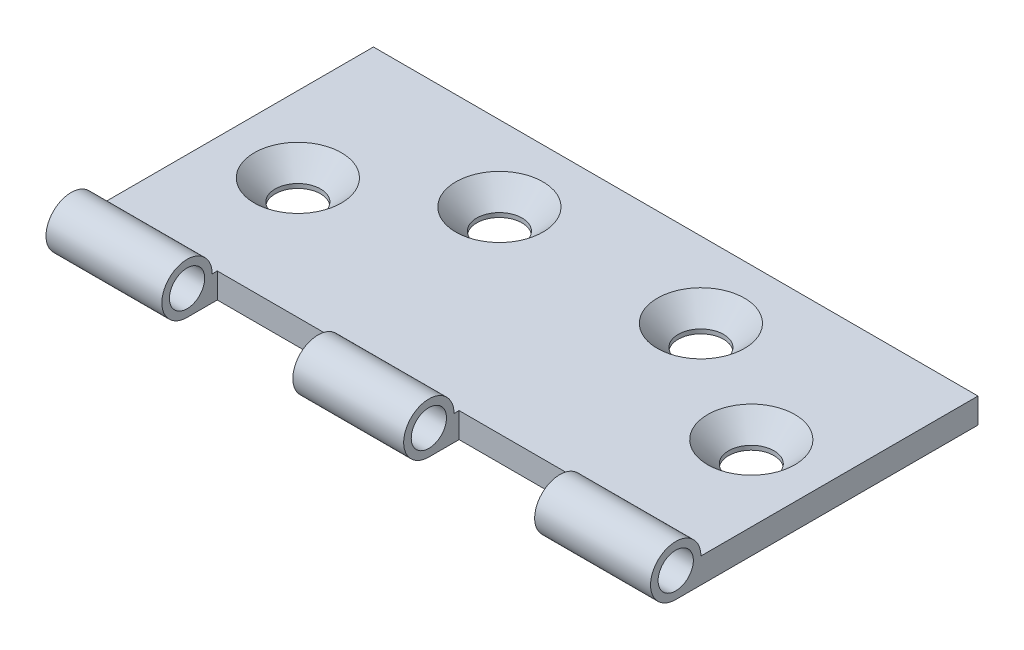
ISO-10303-21;
HEADER;
FILE_DESCRIPTION(('STEP AP214'),'2;1');
FILE_NAME('part.step','',(''),(''),'','','');
FILE_SCHEMA(('AUTOMOTIVE_DESIGN { 1 0 10303 214 1 1 1 1 }'));
ENDSEC;
DATA;
#1=APPLICATION_CONTEXT('core data for automotive mechanical design processes');
#2=APPLICATION_PROTOCOL_DEFINITION('international standard','automotive_design',2000,#1);
#3=PRODUCT_CONTEXT('',#1,'mechanical');
#4=PRODUCT('Part','Part','',(#3));
#5=PRODUCT_RELATED_PRODUCT_CATEGORY('part','',(#4));
#6=PRODUCT_DEFINITION_FORMATION('','',#4);
#7=PRODUCT_DEFINITION_CONTEXT('part definition',#1,'design');
#8=PRODUCT_DEFINITION('design','',#6,#7);
#9=PRODUCT_DEFINITION_SHAPE('','',#8);
#10=(LENGTH_UNIT() NAMED_UNIT(*) SI_UNIT(.MILLI.,.METRE.));
#11=(NAMED_UNIT(*) PLANE_ANGLE_UNIT() SI_UNIT($,.RADIAN.));
#12=(NAMED_UNIT(*) SI_UNIT($,.STERADIAN.) SOLID_ANGLE_UNIT());
#13=UNCERTAINTY_MEASURE_WITH_UNIT(LENGTH_MEASURE(1.E-05),#10,'distance_accuracy_value','');
#14=(GEOMETRIC_REPRESENTATION_CONTEXT(3) GLOBAL_UNCERTAINTY_ASSIGNED_CONTEXT((#13)) GLOBAL_UNIT_ASSIGNED_CONTEXT((#10,
#11,#12)) REPRESENTATION_CONTEXT('',''));
#15=CARTESIAN_POINT('',(0.,0.,0.));
#16=DIRECTION('',(0.,0.,1.));
#17=DIRECTION('',(1.,0.,0.));
#18=AXIS2_PLACEMENT_3D('',#15,#16,#17);
#19=CARTESIAN_POINT('',(60.,5.,60.));
#20=DIRECTION('',(-1.,0.,0.));
#21=DIRECTION('',(0.,0.,1.));
#22=AXIS2_PLACEMENT_3D('',#19,#20,#21);
#23=CYLINDRICAL_SURFACE('',#22,5.);
#24=DIRECTION('',(-1.,0.,0.));
#25=VECTOR('',#24,1.);
#26=CARTESIAN_POINT('',(60.,5.,55.));
#27=LINE('',#26,#25);
#28=CARTESIAN_POINT('',(60.,5.,55.));
#29=VERTEX_POINT('',#28);
#30=CARTESIAN_POINT('',(37.,5.,55.));
#31=VERTEX_POINT('',#30);
#32=EDGE_CURVE('E94',#29,#31,#27,.T.);
#33=ORIENTED_EDGE('',*,*,#32,.T.);
#34=CARTESIAN_POINT('',(37.,5.,60.));
#35=DIRECTION('',(1.,0.,0.));
#36=DIRECTION('',(0.,0.,-1.));
#37=AXIS2_PLACEMENT_3D('',#34,#35,#36);
#38=CIRCLE('',#37,5.);
#39=CARTESIAN_POINT('',(37.,0.,60.));
#40=VERTEX_POINT('',#39);
#41=EDGE_CURVE('E132',#31,#40,#38,.T.);
#42=ORIENTED_EDGE('',*,*,#41,.T.);
#43=DIRECTION('',(-1.,0.,0.));
#44=VECTOR('',#43,1.);
#45=CARTESIAN_POINT('',(60.,0.,60.));
#46=LINE('',#45,#44);
#47=CARTESIAN_POINT('',(60.,0.,60.));
#48=VERTEX_POINT('',#47);
#49=EDGE_CURVE('E11',#48,#40,#46,.T.);
#50=ORIENTED_EDGE('',*,*,#49,.F.);
#51=CARTESIAN_POINT('',(60.,5.,60.));
#52=DIRECTION('',(1.,0.,0.));
#53=DIRECTION('',(0.,0.,-1.));
#54=AXIS2_PLACEMENT_3D('',#51,#52,#53);
#55=CIRCLE('',#54,5.);
#56=EDGE_CURVE('E182',#29,#48,#55,.T.);
#57=ORIENTED_EDGE('',*,*,#56,.F.);
#58=EDGE_LOOP('',(#33,#42,#50,#57));
#59=FACE_BOUND('',#58,.T.);
#60=ADVANCED_FACE('F39',(#59),#23,.T.);
#61=CARTESIAN_POINT('',(-37.,0.,60.));
#62=VERTEX_POINT('',#61);
#63=CARTESIAN_POINT('',(-60.,0.,60.));
#64=VERTEX_POINT('',#63);
#65=EDGE_CURVE('E51',#62,#64,#46,.T.);
#66=ORIENTED_EDGE('',*,*,#65,.F.);
#67=CARTESIAN_POINT('',(-37.,5.,60.));
#68=DIRECTION('',(-1.,0.,0.));
#69=DIRECTION('',(0.,0.,1.));
#70=AXIS2_PLACEMENT_3D('',#67,#68,#69);
#71=CIRCLE('',#70,5.);
#72=CARTESIAN_POINT('',(-37.,5.,55.));
#73=VERTEX_POINT('',#72);
#74=EDGE_CURVE('E110',#62,#73,#71,.T.);
#75=ORIENTED_EDGE('',*,*,#74,.T.);
#76=CARTESIAN_POINT('',(-60.,5.,55.));
#77=VERTEX_POINT('',#76);
#78=EDGE_CURVE('E188',#73,#77,#27,.T.);
#79=ORIENTED_EDGE('',*,*,#78,.T.);
#80=CARTESIAN_POINT('',(-60.,5.,60.));
#81=DIRECTION('',(1.,0.,0.));
#82=DIRECTION('',(0.,0.,-1.));
#83=AXIS2_PLACEMENT_3D('',#80,#81,#82);
#84=CIRCLE('',#83,5.);
#85=EDGE_CURVE('E92',#77,#64,#84,.T.);
#86=ORIENTED_EDGE('',*,*,#85,.T.);
#87=EDGE_LOOP('',(#66,#75,#79,#86));
#88=FACE_BOUND('',#87,.T.);
#89=ADVANCED_FACE('F299',(#88),#23,.T.);
#90=CARTESIAN_POINT('',(-60.,4.99999999999999,60.));
#91=DIRECTION('',(1.,0.,0.));
#92=DIRECTION('',(0.,0.,-1.));
#93=AXIS2_PLACEMENT_3D('',#90,#91,#92);
#94=CYLINDRICAL_SURFACE('',#93,3.5);
#95=CARTESIAN_POINT('',(37.,4.99999999999999,60.));
#96=DIRECTION('',(1.,0.,0.));
#97=DIRECTION('',(0.,0.,-1.));
#98=AXIS2_PLACEMENT_3D('',#95,#96,#97);
#99=CIRCLE('',#98,3.5);
#100=CARTESIAN_POINT('',(37.,4.99999999999999,56.5));
#101=VERTEX_POINT('',#100);
#102=EDGE_CURVE('E43',#101,#101,#99,.F.);
#103=ORIENTED_EDGE('',*,*,#102,.T.);
#104=EDGE_LOOP('',(#103));
#105=FACE_BOUND('',#104,.T.);
#106=CARTESIAN_POINT('',(60.,4.99999999999999,60.));
#107=DIRECTION('',(1.,0.,0.));
#108=DIRECTION('',(0.,0.,-1.));
#109=AXIS2_PLACEMENT_3D('',#106,#107,#108);
#110=CIRCLE('',#109,3.5);
#111=CARTESIAN_POINT('',(60.,4.99999999999999,56.5));
#112=VERTEX_POINT('',#111);
#113=EDGE_CURVE('E178',#112,#112,#110,.T.);
#114=ORIENTED_EDGE('',*,*,#113,.T.);
#115=EDGE_LOOP('',(#114));
#116=FACE_BOUND('',#115,.T.);
#117=ADVANCED_FACE('F316',(#105,#116),#94,.F.);
#118=CARTESIAN_POINT('',(-37.,4.99999999999999,60.));
#119=DIRECTION('',(-1.,0.,0.));
#120=DIRECTION('',(0.,0.,1.));
#121=AXIS2_PLACEMENT_3D('',#118,#119,#120);
#122=CIRCLE('',#121,3.5);
#123=CARTESIAN_POINT('',(-37.,4.99999999999999,63.5));
#124=VERTEX_POINT('',#123);
#125=EDGE_CURVE('E108',#124,#124,#122,.F.);
#126=ORIENTED_EDGE('',*,*,#125,.T.);
#127=EDGE_LOOP('',(#126));
#128=FACE_BOUND('',#127,.T.);
#129=CARTESIAN_POINT('',(-60.,4.99999999999999,60.));
#130=DIRECTION('',(1.,0.,0.));
#131=DIRECTION('',(0.,0.,-1.));
#132=AXIS2_PLACEMENT_3D('',#129,#130,#131);
#133=CIRCLE('',#132,3.5);
#134=CARTESIAN_POINT('',(-60.,4.99999999999999,56.5));
#135=VERTEX_POINT('',#134);
#136=EDGE_CURVE('E179',#135,#135,#133,.T.);
#137=ORIENTED_EDGE('',*,*,#136,.F.);
#138=EDGE_LOOP('',(#137));
#139=FACE_BOUND('',#138,.T.);
#140=ADVANCED_FACE('F341',(#128,#139),#94,.F.);
#141=CARTESIAN_POINT('',(60.,5.,0.));
#142=DIRECTION('',(0.,-1.,0.));
#143=DIRECTION('',(0.,0.,-1.));
#144=AXIS2_PLACEMENT_3D('',#141,#142,#143);
#145=PLANE('',#144);
#146=CARTESIAN_POINT('',(-45.,5.,30.));
#147=DIRECTION('',(0.,1.,0.));
#148=DIRECTION('',(0.,0.,1.));
#149=AXIS2_PLACEMENT_3D('',#146,#147,#148);
#150=CIRCLE('',#149,8.65);
#151=CARTESIAN_POINT('',(-45.,5.,38.65));
#152=VERTEX_POINT('',#151);
#153=EDGE_CURVE('E142',#152,#152,#150,.T.);
#154=ORIENTED_EDGE('',*,*,#153,.F.);
#155=EDGE_LOOP('',(#154));
#156=FACE_BOUND('',#155,.T.);
#157=CARTESIAN_POINT('',(-20.,5.,15.));
#158=DIRECTION('',(0.,1.,0.));
#159=DIRECTION('',(0.,0.,1.));
#160=AXIS2_PLACEMENT_3D('',#157,#158,#159);
#161=CIRCLE('',#160,8.65);
#162=CARTESIAN_POINT('',(-20.,5.,23.65));
#163=VERTEX_POINT('',#162);
#164=EDGE_CURVE('E151',#163,#163,#161,.T.);
#165=ORIENTED_EDGE('',*,*,#164,.F.);
#166=EDGE_LOOP('',(#165));
#167=FACE_BOUND('',#166,.T.);
#168=CARTESIAN_POINT('',(45.,5.,30.));
#169=DIRECTION('',(0.,1.,0.));
#170=DIRECTION('',(0.,0.,1.));
#171=AXIS2_PLACEMENT_3D('',#168,#169,#170);
#172=CIRCLE('',#171,8.65);
#173=CARTESIAN_POINT('',(45.,5.,38.65));
#174=VERTEX_POINT('',#173);
#175=EDGE_CURVE('E160',#174,#174,#172,.T.);
#176=ORIENTED_EDGE('',*,*,#175,.F.);
#177=EDGE_LOOP('',(#176));
#178=FACE_BOUND('',#177,.T.);
#179=CARTESIAN_POINT('',(20.,5.,15.));
#180=DIRECTION('',(0.,1.,0.));
#181=DIRECTION('',(0.,0.,1.));
#182=AXIS2_PLACEMENT_3D('',#179,#180,#181);
#183=CIRCLE('',#182,8.65);
#184=CARTESIAN_POINT('',(20.,5.,23.65));
#185=VERTEX_POINT('',#184);
#186=EDGE_CURVE('E169',#185,#185,#183,.T.);
#187=ORIENTED_EDGE('',*,*,#186,.F.);
#188=EDGE_LOOP('',(#187));
#189=FACE_BOUND('',#188,.T.);
#190=DIRECTION('',(1.,0.,0.));
#191=VECTOR('',#190,1.);
#192=CARTESIAN_POINT('',(60.,5.,54.));
#193=LINE('',#192,#191);
#194=CARTESIAN_POINT('',(11.,5.,54.));
#195=VERTEX_POINT('',#194);
#196=CARTESIAN_POINT('',(37.,5.,54.));
#197=VERTEX_POINT('',#196);
#198=EDGE_CURVE('E140',#195,#197,#193,.T.);
#199=ORIENTED_EDGE('',*,*,#198,.T.);
#200=DIRECTION('',(0.,0.,1.));
#201=VECTOR('',#200,1.);
#202=CARTESIAN_POINT('',(37.,5.,0.));
#203=LINE('',#202,#201);
#204=EDGE_CURVE('E135',#197,#31,#203,.T.);
#205=ORIENTED_EDGE('',*,*,#204,.T.);
#206=ORIENTED_EDGE('',*,*,#32,.F.);
#207=DIRECTION('',(0.,0.,1.));
#208=VECTOR('',#207,1.);
#209=CARTESIAN_POINT('',(60.,5.,0.));
#210=LINE('',#209,#208);
#211=CARTESIAN_POINT('',(60.,5.,0.));
#212=VERTEX_POINT('',#211);
#213=EDGE_CURVE('E81',#212,#29,#210,.T.);
#214=ORIENTED_EDGE('',*,*,#213,.F.);
#215=DIRECTION('',(-1.,0.,0.));
#216=VECTOR('',#215,1.);
#217=CARTESIAN_POINT('',(60.,5.,0.));
#218=LINE('',#217,#216);
#219=CARTESIAN_POINT('',(-60.,5.,0.));
#220=VERTEX_POINT('',#219);
#221=EDGE_CURVE('E59',#212,#220,#218,.T.);
#222=ORIENTED_EDGE('',*,*,#221,.T.);
#223=DIRECTION('',(0.,0.,1.));
#224=VECTOR('',#223,1.);
#225=CARTESIAN_POINT('',(-60.,5.,0.));
#226=LINE('',#225,#224);
#227=EDGE_CURVE('E78',#220,#77,#226,.T.);
#228=ORIENTED_EDGE('',*,*,#227,.T.);
#229=ORIENTED_EDGE('',*,*,#78,.F.);
#230=DIRECTION('',(0.,0.,-1.));
#231=VECTOR('',#230,1.);
#232=CARTESIAN_POINT('',(-37.,5.,0.));
#233=LINE('',#232,#231);
#234=CARTESIAN_POINT('',(-37.,5.,54.));
#235=VERTEX_POINT('',#234);
#236=EDGE_CURVE('E115',#73,#235,#233,.T.);
#237=ORIENTED_EDGE('',*,*,#236,.T.);
#238=DIRECTION('',(1.,0.,0.));
#239=VECTOR('',#238,1.);
#240=CARTESIAN_POINT('',(60.,5.,54.));
#241=LINE('',#240,#239);
#242=CARTESIAN_POINT('',(-11.,5.,54.));
#243=VERTEX_POINT('',#242);
#244=EDGE_CURVE('E138',#235,#243,#241,.T.);
#245=ORIENTED_EDGE('',*,*,#244,.T.);
#246=DIRECTION('',(0.,0.,1.));
#247=VECTOR('',#246,1.);
#248=CARTESIAN_POINT('',(-11.,5.,0.));
#249=LINE('',#248,#247);
#250=CARTESIAN_POINT('',(-11.,5.,55.));
#251=VERTEX_POINT('',#250);
#252=EDGE_CURVE('E111',#243,#251,#249,.T.);
#253=ORIENTED_EDGE('',*,*,#252,.T.);
#254=CARTESIAN_POINT('',(11.,5.,55.));
#255=VERTEX_POINT('',#254);
#256=EDGE_CURVE('E190',#255,#251,#27,.T.);
#257=ORIENTED_EDGE('',*,*,#256,.F.);
#258=DIRECTION('',(0.,0.,-1.));
#259=VECTOR('',#258,1.);
#260=CARTESIAN_POINT('',(11.,5.,0.));
#261=LINE('',#260,#259);
#262=EDGE_CURVE('E119',#255,#195,#261,.T.);
#263=ORIENTED_EDGE('',*,*,#262,.T.);
#264=EDGE_LOOP('',(#199,#205,#206,#214,#222,#228,#229,#237,#245,#253,#257,#263));
#265=FACE_BOUND('',#264,.T.);
#266=ADVANCED_FACE('F41',(#156,#167,#178,#189,#265),#145,.F.);
#267=CARTESIAN_POINT('',(60.,0.,0.));
#268=DIRECTION('',(0.,-1.,0.));
#269=DIRECTION('',(0.,0.,-1.));
#270=AXIS2_PLACEMENT_3D('',#267,#268,#269);
#271=PLANE('',#270);
#272=DIRECTION('',(0.,0.,-1.));
#273=VECTOR('',#272,1.);
#274=CARTESIAN_POINT('',(37.,0.,65.));
#275=LINE('',#274,#273);
#276=CARTESIAN_POINT('',(37.,0.,54.));
#277=VERTEX_POINT('',#276);
#278=EDGE_CURVE('E259',#40,#277,#275,.T.);
#279=ORIENTED_EDGE('',*,*,#278,.T.);
#280=DIRECTION('',(-1.,0.,0.));
#281=VECTOR('',#280,1.);
#282=CARTESIAN_POINT('',(37.,0.,54.));
#283=LINE('',#282,#281);
#284=CARTESIAN_POINT('',(11.,0.,54.));
#285=VERTEX_POINT('',#284);
#286=EDGE_CURVE('E264',#277,#285,#283,.T.);
#287=ORIENTED_EDGE('',*,*,#286,.T.);
#288=DIRECTION('',(0.,0.,1.));
#289=VECTOR('',#288,1.);
#290=CARTESIAN_POINT('',(11.,0.,65.));
#291=LINE('',#290,#289);
#292=CARTESIAN_POINT('',(11.,0.,60.));
#293=VERTEX_POINT('',#292);
#294=EDGE_CURVE('E261',#285,#293,#291,.T.);
#295=ORIENTED_EDGE('',*,*,#294,.T.);
#296=CARTESIAN_POINT('',(-11.,0.,60.));
#297=VERTEX_POINT('',#296);
#298=EDGE_CURVE('E49',#293,#297,#46,.T.);
#299=ORIENTED_EDGE('',*,*,#298,.T.);
#300=DIRECTION('',(0.,0.,-1.));
#301=VECTOR('',#300,1.);
#302=CARTESIAN_POINT('',(-11.,0.,65.));
#303=LINE('',#302,#301);
#304=CARTESIAN_POINT('',(-11.,0.,54.));
#305=VERTEX_POINT('',#304);
#306=EDGE_CURVE('E270',#297,#305,#303,.T.);
#307=ORIENTED_EDGE('',*,*,#306,.T.);
#308=DIRECTION('',(-1.,0.,0.));
#309=VECTOR('',#308,1.);
#310=CARTESIAN_POINT('',(-11.,0.,54.));
#311=LINE('',#310,#309);
#312=CARTESIAN_POINT('',(-37.,0.,54.));
#313=VERTEX_POINT('',#312);
#314=EDGE_CURVE('E273',#305,#313,#311,.T.);
#315=ORIENTED_EDGE('',*,*,#314,.T.);
#316=DIRECTION('',(0.,0.,1.));
#317=VECTOR('',#316,1.);
#318=CARTESIAN_POINT('',(-37.,0.,65.));
#319=LINE('',#318,#317);
#320=EDGE_CURVE('E281',#313,#62,#319,.T.);
#321=ORIENTED_EDGE('',*,*,#320,.T.);
#322=ORIENTED_EDGE('',*,*,#65,.T.);
#323=DIRECTION('',(0.,0.,1.));
#324=VECTOR('',#323,1.);
#325=CARTESIAN_POINT('',(-60.,0.,0.));
#326=LINE('',#325,#324);
#327=CARTESIAN_POINT('',(-60.,0.,0.));
#328=VERTEX_POINT('',#327);
#329=EDGE_CURVE('E93',#328,#64,#326,.T.);
#330=ORIENTED_EDGE('',*,*,#329,.F.);
#331=DIRECTION('',(-1.,0.,0.));
#332=VECTOR('',#331,1.);
#333=CARTESIAN_POINT('',(60.,0.,0.));
#334=LINE('',#333,#332);
#335=CARTESIAN_POINT('',(60.,0.,0.));
#336=VERTEX_POINT('',#335);
#337=EDGE_CURVE('E70',#336,#328,#334,.T.);
#338=ORIENTED_EDGE('',*,*,#337,.F.);
#339=DIRECTION('',(0.,0.,1.));
#340=VECTOR('',#339,1.);
#341=CARTESIAN_POINT('',(60.,0.,0.));
#342=LINE('',#341,#340);
#343=EDGE_CURVE('E98',#336,#48,#342,.T.);
#344=ORIENTED_EDGE('',*,*,#343,.T.);
#345=ORIENTED_EDGE('',*,*,#49,.T.);
#346=EDGE_LOOP('',(#279,#287,#295,#299,#307,#315,#321,#322,#330,#338,#344,#345));
#347=FACE_BOUND('',#346,.T.);
#348=CARTESIAN_POINT('',(-45.,0.,30.));
#349=DIRECTION('',(0.,1.,0.));
#350=DIRECTION('',(0.,0.,1.));
#351=AXIS2_PLACEMENT_3D('',#348,#349,#350);
#352=CIRCLE('',#351,4.5);
#353=CARTESIAN_POINT('',(-45.,0.,34.5));
#354=VERTEX_POINT('',#353);
#355=EDGE_CURVE('E148',#354,#354,#352,.T.);
#356=ORIENTED_EDGE('',*,*,#355,.T.);
#357=EDGE_LOOP('',(#356));
#358=FACE_BOUND('',#357,.T.);
#359=CARTESIAN_POINT('',(-20.,0.,15.));
#360=DIRECTION('',(0.,1.,0.));
#361=DIRECTION('',(0.,0.,1.));
#362=AXIS2_PLACEMENT_3D('',#359,#360,#361);
#363=CIRCLE('',#362,4.5);
#364=CARTESIAN_POINT('',(-20.,0.,19.5));
#365=VERTEX_POINT('',#364);
#366=EDGE_CURVE('E157',#365,#365,#363,.T.);
#367=ORIENTED_EDGE('',*,*,#366,.T.);
#368=EDGE_LOOP('',(#367));
#369=FACE_BOUND('',#368,.T.);
#370=CARTESIAN_POINT('',(45.,0.,30.));
#371=DIRECTION('',(0.,1.,0.));
#372=DIRECTION('',(0.,0.,1.));
#373=AXIS2_PLACEMENT_3D('',#370,#371,#372);
#374=CIRCLE('',#373,4.5);
#375=CARTESIAN_POINT('',(45.,0.,34.5));
#376=VERTEX_POINT('',#375);
#377=EDGE_CURVE('E166',#376,#376,#374,.T.);
#378=ORIENTED_EDGE('',*,*,#377,.T.);
#379=EDGE_LOOP('',(#378));
#380=FACE_BOUND('',#379,.T.);
#381=CARTESIAN_POINT('',(20.,0.,15.));
#382=DIRECTION('',(0.,1.,0.));
#383=DIRECTION('',(0.,0.,1.));
#384=AXIS2_PLACEMENT_3D('',#381,#382,#383);
#385=CIRCLE('',#384,4.5);
#386=CARTESIAN_POINT('',(20.,0.,19.5));
#387=VERTEX_POINT('',#386);
#388=EDGE_CURVE('E175',#387,#387,#385,.T.);
#389=ORIENTED_EDGE('',*,*,#388,.T.);
#390=EDGE_LOOP('',(#389));
#391=FACE_BOUND('',#390,.T.);
#392=ADVANCED_FACE('F201',(#347,#358,#369,#380,#391),#271,.T.);
#393=CARTESIAN_POINT('',(60.,5.,0.));
#394=DIRECTION('',(0.,0.,-1.));
#395=DIRECTION('',(-1.,0.,0.));
#396=AXIS2_PLACEMENT_3D('',#393,#394,#395);
#397=PLANE('',#396);
#398=DIRECTION('',(0.,-1.,0.));
#399=VECTOR('',#398,1.);
#400=CARTESIAN_POINT('',(-60.,5.,0.));
#401=LINE('',#400,#399);
#402=EDGE_CURVE('E90',#220,#328,#401,.T.);
#403=ORIENTED_EDGE('',*,*,#402,.F.);
#404=ORIENTED_EDGE('',*,*,#221,.F.);
#405=DIRECTION('',(0.,-1.,0.));
#406=VECTOR('',#405,1.);
#407=CARTESIAN_POINT('',(60.,5.,0.));
#408=LINE('',#407,#406);
#409=EDGE_CURVE('E83',#212,#336,#408,.T.);
#410=ORIENTED_EDGE('',*,*,#409,.T.);
#411=ORIENTED_EDGE('',*,*,#337,.T.);
#412=EDGE_LOOP('',(#403,#404,#410,#411));
#413=FACE_BOUND('',#412,.T.);
#414=ADVANCED_FACE('F96',(#413),#397,.T.);
#415=CARTESIAN_POINT('',(60.,0.,0.));
#416=DIRECTION('',(-1.,0.,0.));
#417=DIRECTION('',(0.,-1.,0.));
#418=AXIS2_PLACEMENT_3D('',#415,#416,#417);
#419=PLANE('',#418);
#420=ORIENTED_EDGE('',*,*,#113,.F.);
#421=EDGE_LOOP('',(#420));
#422=FACE_BOUND('',#421,.T.);
#423=ORIENTED_EDGE('',*,*,#213,.T.);
#424=ORIENTED_EDGE('',*,*,#56,.T.);
#425=ORIENTED_EDGE('',*,*,#343,.F.);
#426=ORIENTED_EDGE('',*,*,#409,.F.);
#427=EDGE_LOOP('',(#423,#424,#425,#426));
#428=FACE_BOUND('',#427,.T.);
#429=ADVANCED_FACE('F196',(#422,#428),#419,.F.);
#430=CARTESIAN_POINT('',(-60.,0.,0.));
#431=DIRECTION('',(-1.,0.,0.));
#432=DIRECTION('',(0.,-1.,0.));
#433=AXIS2_PLACEMENT_3D('',#430,#431,#432);
#434=PLANE('',#433);
#435=ORIENTED_EDGE('',*,*,#136,.T.);
#436=EDGE_LOOP('',(#435));
#437=FACE_BOUND('',#436,.T.);
#438=ORIENTED_EDGE('',*,*,#329,.T.);
#439=ORIENTED_EDGE('',*,*,#85,.F.);
#440=ORIENTED_EDGE('',*,*,#227,.F.);
#441=ORIENTED_EDGE('',*,*,#402,.T.);
#442=EDGE_LOOP('',(#438,#439,#440,#441));
#443=FACE_BOUND('',#442,.T.);
#444=ADVANCED_FACE('F89',(#437,#443),#434,.T.);
#445=ORIENTED_EDGE('',*,*,#298,.F.);
#446=CARTESIAN_POINT('',(11.,5.,60.));
#447=DIRECTION('',(-1.,0.,0.));
#448=DIRECTION('',(0.,0.,1.));
#449=AXIS2_PLACEMENT_3D('',#446,#447,#448);
#450=CIRCLE('',#449,5.);
#451=EDGE_CURVE('E114',#293,#255,#450,.T.);
#452=ORIENTED_EDGE('',*,*,#451,.T.);
#453=ORIENTED_EDGE('',*,*,#256,.T.);
#454=CARTESIAN_POINT('',(-11.,5.,60.));
#455=DIRECTION('',(1.,0.,0.));
#456=DIRECTION('',(0.,0.,-1.));
#457=AXIS2_PLACEMENT_3D('',#454,#455,#456);
#458=CIRCLE('',#457,5.);
#459=EDGE_CURVE('E106',#251,#297,#458,.T.);
#460=ORIENTED_EDGE('',*,*,#459,.T.);
#461=EDGE_LOOP('',(#445,#452,#453,#460));
#462=FACE_BOUND('',#461,.T.);
#463=ADVANCED_FACE('F295',(#462),#23,.T.);
#464=CARTESIAN_POINT('',(20.,5.,15.));
#465=DIRECTION('',(0.,1.,0.));
#466=DIRECTION('',(0.,0.,1.));
#467=AXIS2_PLACEMENT_3D('',#464,#465,#466);
#468=CYLINDRICAL_SURFACE('',#467,4.5);
#469=ORIENTED_EDGE('',*,*,#388,.F.);
#470=EDGE_LOOP('',(#469));
#471=FACE_BOUND('',#470,.T.);
#472=CARTESIAN_POINT('',(20.,0.850000000000001,15.));
#473=DIRECTION('',(0.,1.,0.));
#474=DIRECTION('',(0.,0.,1.));
#475=AXIS2_PLACEMENT_3D('',#472,#473,#474);
#476=CIRCLE('',#475,4.5);
#477=CARTESIAN_POINT('',(20.,0.850000000000001,19.5));
#478=VERTEX_POINT('',#477);
#479=EDGE_CURVE('E172',#478,#478,#476,.T.);
#480=ORIENTED_EDGE('',*,*,#479,.T.);
#481=EDGE_LOOP('',(#480));
#482=FACE_BOUND('',#481,.T.);
#483=ADVANCED_FACE('F320',(#471,#482),#468,.F.);
#484=CARTESIAN_POINT('',(20.,5.,15.));
#485=DIRECTION('',(0.,1.,0.));
#486=DIRECTION('',(0.,0.,1.));
#487=AXIS2_PLACEMENT_3D('',#484,#485,#486);
#488=CONICAL_SURFACE('',#487,8.65,0.785398163397448);
#489=ORIENTED_EDGE('',*,*,#479,.F.);
#490=EDGE_LOOP('',(#489));
#491=FACE_BOUND('',#490,.T.);
#492=ORIENTED_EDGE('',*,*,#186,.T.);
#493=EDGE_LOOP('',(#492));
#494=FACE_BOUND('',#493,.T.);
#495=ADVANCED_FACE('F326',(#491,#494),#488,.F.);
#496=CARTESIAN_POINT('',(45.,5.,30.));
#497=DIRECTION('',(0.,1.,0.));
#498=DIRECTION('',(0.,0.,1.));
#499=AXIS2_PLACEMENT_3D('',#496,#497,#498);
#500=CYLINDRICAL_SURFACE('',#499,4.5);
#501=ORIENTED_EDGE('',*,*,#377,.F.);
#502=EDGE_LOOP('',(#501));
#503=FACE_BOUND('',#502,.T.);
#504=CARTESIAN_POINT('',(45.,0.850000000000001,30.));
#505=DIRECTION('',(0.,1.,0.));
#506=DIRECTION('',(0.,0.,1.));
#507=AXIS2_PLACEMENT_3D('',#504,#505,#506);
#508=CIRCLE('',#507,4.5);
#509=CARTESIAN_POINT('',(45.,0.850000000000001,34.5));
#510=VERTEX_POINT('',#509);
#511=EDGE_CURVE('E163',#510,#510,#508,.T.);
#512=ORIENTED_EDGE('',*,*,#511,.T.);
#513=EDGE_LOOP('',(#512));
#514=FACE_BOUND('',#513,.T.);
#515=ADVANCED_FACE('F357',(#503,#514),#500,.F.);
#516=CARTESIAN_POINT('',(45.,5.,30.));
#517=DIRECTION('',(0.,1.,0.));
#518=DIRECTION('',(0.,0.,1.));
#519=AXIS2_PLACEMENT_3D('',#516,#517,#518);
#520=CONICAL_SURFACE('',#519,8.65,0.785398163397448);
#521=ORIENTED_EDGE('',*,*,#511,.F.);
#522=EDGE_LOOP('',(#521));
#523=FACE_BOUND('',#522,.T.);
#524=ORIENTED_EDGE('',*,*,#175,.T.);
#525=EDGE_LOOP('',(#524));
#526=FACE_BOUND('',#525,.T.);
#527=ADVANCED_FACE('F363',(#523,#526),#520,.F.);
#528=CARTESIAN_POINT('',(-20.,5.,15.));
#529=DIRECTION('',(0.,1.,0.));
#530=DIRECTION('',(0.,0.,1.));
#531=AXIS2_PLACEMENT_3D('',#528,#529,#530);
#532=CYLINDRICAL_SURFACE('',#531,4.5);
#533=ORIENTED_EDGE('',*,*,#366,.F.);
#534=EDGE_LOOP('',(#533));
#535=FACE_BOUND('',#534,.T.);
#536=CARTESIAN_POINT('',(-20.,0.850000000000001,15.));
#537=DIRECTION('',(0.,1.,0.));
#538=DIRECTION('',(0.,0.,1.));
#539=AXIS2_PLACEMENT_3D('',#536,#537,#538);
#540=CIRCLE('',#539,4.5);
#541=CARTESIAN_POINT('',(-20.,0.850000000000001,19.5));
#542=VERTEX_POINT('',#541);
#543=EDGE_CURVE('E154',#542,#542,#540,.T.);
#544=ORIENTED_EDGE('',*,*,#543,.T.);
#545=EDGE_LOOP('',(#544));
#546=FACE_BOUND('',#545,.T.);
#547=ADVANCED_FACE('F408',(#535,#546),#532,.F.);
#548=CARTESIAN_POINT('',(-20.,5.,15.));
#549=DIRECTION('',(0.,1.,0.));
#550=DIRECTION('',(0.,0.,1.));
#551=AXIS2_PLACEMENT_3D('',#548,#549,#550);
#552=CONICAL_SURFACE('',#551,8.65,0.785398163397448);
#553=ORIENTED_EDGE('',*,*,#543,.F.);
#554=EDGE_LOOP('',(#553));
#555=FACE_BOUND('',#554,.T.);
#556=ORIENTED_EDGE('',*,*,#164,.T.);
#557=EDGE_LOOP('',(#556));
#558=FACE_BOUND('',#557,.T.);
#559=ADVANCED_FACE('F404',(#555,#558),#552,.F.);
#560=CARTESIAN_POINT('',(-45.,5.,30.));
#561=DIRECTION('',(0.,1.,0.));
#562=DIRECTION('',(0.,0.,1.));
#563=AXIS2_PLACEMENT_3D('',#560,#561,#562);
#564=CYLINDRICAL_SURFACE('',#563,4.5);
#565=ORIENTED_EDGE('',*,*,#355,.F.);
#566=EDGE_LOOP('',(#565));
#567=FACE_BOUND('',#566,.T.);
#568=CARTESIAN_POINT('',(-45.,0.850000000000001,30.));
#569=DIRECTION('',(0.,1.,0.));
#570=DIRECTION('',(0.,0.,1.));
#571=AXIS2_PLACEMENT_3D('',#568,#569,#570);
#572=CIRCLE('',#571,4.5);
#573=CARTESIAN_POINT('',(-45.,0.850000000000001,34.5));
#574=VERTEX_POINT('',#573);
#575=EDGE_CURVE('E145',#574,#574,#572,.T.);
#576=ORIENTED_EDGE('',*,*,#575,.T.);
#577=EDGE_LOOP('',(#576));
#578=FACE_BOUND('',#577,.T.);
#579=ADVANCED_FACE('F400',(#567,#578),#564,.F.);
#580=CARTESIAN_POINT('',(-45.,5.,30.));
#581=DIRECTION('',(0.,1.,0.));
#582=DIRECTION('',(0.,0.,1.));
#583=AXIS2_PLACEMENT_3D('',#580,#581,#582);
#584=CONICAL_SURFACE('',#583,8.65,0.785398163397448);
#585=ORIENTED_EDGE('',*,*,#575,.F.);
#586=EDGE_LOOP('',(#585));
#587=FACE_BOUND('',#586,.T.);
#588=ORIENTED_EDGE('',*,*,#153,.T.);
#589=EDGE_LOOP('',(#588));
#590=FACE_BOUND('',#589,.T.);
#591=ADVANCED_FACE('F395',(#587,#590),#584,.F.);
#592=CARTESIAN_POINT('',(-11.,0.,54.));
#593=DIRECTION('',(0.,0.,-1.));
#594=DIRECTION('',(-1.,0.,0.));
#595=AXIS2_PLACEMENT_3D('',#592,#593,#594);
#596=PLANE('',#595);
#597=DIRECTION('',(0.,1.,0.));
#598=VECTOR('',#597,1.);
#599=CARTESIAN_POINT('',(-37.,0.,54.));
#600=LINE('',#599,#598);
#601=EDGE_CURVE('E282',#313,#235,#600,.T.);
#602=ORIENTED_EDGE('',*,*,#601,.F.);
#603=ORIENTED_EDGE('',*,*,#314,.F.);
#604=DIRECTION('',(0.,1.,0.));
#605=VECTOR('',#604,1.);
#606=CARTESIAN_POINT('',(-11.,0.,54.));
#607=LINE('',#606,#605);
#608=EDGE_CURVE('E278',#305,#243,#607,.T.);
#609=ORIENTED_EDGE('',*,*,#608,.T.);
#610=ORIENTED_EDGE('',*,*,#244,.F.);
#611=EDGE_LOOP('',(#602,#603,#609,#610));
#612=FACE_BOUND('',#611,.T.);
#613=ADVANCED_FACE('F306',(#612),#596,.F.);
#614=CARTESIAN_POINT('',(-37.,0.,65.));
#615=DIRECTION('',(-1.,0.,0.));
#616=DIRECTION('',(0.,0.,1.));
#617=AXIS2_PLACEMENT_3D('',#614,#615,#616);
#618=PLANE('',#617);
#619=ORIENTED_EDGE('',*,*,#125,.F.);
#620=EDGE_LOOP('',(#619));
#621=FACE_BOUND('',#620,.T.);
#622=ORIENTED_EDGE('',*,*,#74,.F.);
#623=ORIENTED_EDGE('',*,*,#320,.F.);
#624=ORIENTED_EDGE('',*,*,#601,.T.);
#625=ORIENTED_EDGE('',*,*,#236,.F.);
#626=EDGE_LOOP('',(#622,#623,#624,#625));
#627=FACE_BOUND('',#626,.T.);
#628=ADVANCED_FACE('F302',(#621,#627),#618,.F.);
#629=CARTESIAN_POINT('',(-11.,0.,65.));
#630=DIRECTION('',(1.,0.,0.));
#631=DIRECTION('',(0.,0.,-1.));
#632=AXIS2_PLACEMENT_3D('',#629,#630,#631);
#633=PLANE('',#632);
#634=CARTESIAN_POINT('',(-11.,4.99999999999999,60.));
#635=DIRECTION('',(1.,0.,0.));
#636=DIRECTION('',(0.,0.,-1.));
#637=AXIS2_PLACEMENT_3D('',#634,#635,#636);
#638=CIRCLE('',#637,3.5);
#639=CARTESIAN_POINT('',(-11.,4.99999999999999,56.5));
#640=VERTEX_POINT('',#639);
#641=EDGE_CURVE('E103',#640,#640,#638,.F.);
#642=ORIENTED_EDGE('',*,*,#641,.F.);
#643=EDGE_LOOP('',(#642));
#644=FACE_BOUND('',#643,.T.);
#645=ORIENTED_EDGE('',*,*,#459,.F.);
#646=ORIENTED_EDGE('',*,*,#252,.F.);
#647=ORIENTED_EDGE('',*,*,#608,.F.);
#648=ORIENTED_EDGE('',*,*,#306,.F.);
#649=EDGE_LOOP('',(#645,#646,#647,#648));
#650=FACE_BOUND('',#649,.T.);
#651=ADVANCED_FACE('F307',(#644,#650),#633,.F.);
#652=CARTESIAN_POINT('',(37.,0.,54.));
#653=DIRECTION('',(0.,0.,-1.));
#654=DIRECTION('',(-1.,0.,0.));
#655=AXIS2_PLACEMENT_3D('',#652,#653,#654);
#656=PLANE('',#655);
#657=DIRECTION('',(0.,1.,0.));
#658=VECTOR('',#657,1.);
#659=CARTESIAN_POINT('',(11.,0.,54.));
#660=LINE('',#659,#658);
#661=EDGE_CURVE('E107',#285,#195,#660,.T.);
#662=ORIENTED_EDGE('',*,*,#661,.F.);
#663=ORIENTED_EDGE('',*,*,#286,.F.);
#664=DIRECTION('',(0.,1.,0.));
#665=VECTOR('',#664,1.);
#666=CARTESIAN_POINT('',(37.,0.,54.));
#667=LINE('',#666,#665);
#668=EDGE_CURVE('E256',#277,#197,#667,.T.);
#669=ORIENTED_EDGE('',*,*,#668,.T.);
#670=ORIENTED_EDGE('',*,*,#198,.F.);
#671=EDGE_LOOP('',(#662,#663,#669,#670));
#672=FACE_BOUND('',#671,.T.);
#673=ADVANCED_FACE('F265',(#672),#656,.F.);
#674=CARTESIAN_POINT('',(37.,0.,65.));
#675=DIRECTION('',(1.,0.,0.));
#676=DIRECTION('',(0.,0.,-1.));
#677=AXIS2_PLACEMENT_3D('',#674,#675,#676);
#678=PLANE('',#677);
#679=ORIENTED_EDGE('',*,*,#102,.F.);
#680=EDGE_LOOP('',(#679));
#681=FACE_BOUND('',#680,.T.);
#682=ORIENTED_EDGE('',*,*,#41,.F.);
#683=ORIENTED_EDGE('',*,*,#204,.F.);
#684=ORIENTED_EDGE('',*,*,#668,.F.);
#685=ORIENTED_EDGE('',*,*,#278,.F.);
#686=EDGE_LOOP('',(#682,#683,#684,#685));
#687=FACE_BOUND('',#686,.T.);
#688=ADVANCED_FACE('F258',(#681,#687),#678,.F.);
#689=CARTESIAN_POINT('',(11.,0.,65.));
#690=DIRECTION('',(-1.,0.,0.));
#691=DIRECTION('',(0.,0.,1.));
#692=AXIS2_PLACEMENT_3D('',#689,#690,#691);
#693=PLANE('',#692);
#694=CARTESIAN_POINT('',(11.,4.99999999999999,60.));
#695=DIRECTION('',(-1.,0.,0.));
#696=DIRECTION('',(0.,0.,1.));
#697=AXIS2_PLACEMENT_3D('',#694,#695,#696);
#698=CIRCLE('',#697,3.5);
#699=CARTESIAN_POINT('',(11.,4.99999999999999,63.5));
#700=VERTEX_POINT('',#699);
#701=EDGE_CURVE('E112',#700,#700,#698,.F.);
#702=ORIENTED_EDGE('',*,*,#701,.F.);
#703=EDGE_LOOP('',(#702));
#704=FACE_BOUND('',#703,.T.);
#705=ORIENTED_EDGE('',*,*,#451,.F.);
#706=ORIENTED_EDGE('',*,*,#294,.F.);
#707=ORIENTED_EDGE('',*,*,#661,.T.);
#708=ORIENTED_EDGE('',*,*,#262,.F.);
#709=EDGE_LOOP('',(#705,#706,#707,#708));
#710=FACE_BOUND('',#709,.T.);
#711=ADVANCED_FACE('F309',(#704,#710),#693,.F.);
#712=ORIENTED_EDGE('',*,*,#701,.T.);
#713=EDGE_LOOP('',(#712));
#714=FACE_BOUND('',#713,.T.);
#715=ORIENTED_EDGE('',*,*,#641,.T.);
#716=EDGE_LOOP('',(#715));
#717=FACE_BOUND('',#716,.T.);
#718=ADVANCED_FACE('F347',(#714,#717),#94,.F.);
#719=CLOSED_SHELL('',(#60,#89,#117,#140,#266,#392,#414,#429,#444,#463,#483,#495,#515,#527,#547,
#559,#579,#591,#613,#628,#651,#673,#688,#711,#718));
#720=MANIFOLD_SOLID_BREP('B2',#719);
#721=ADVANCED_BREP_SHAPE_REPRESENTATION('',(#18,#720),#14);
#722=SHAPE_DEFINITION_REPRESENTATION(#9,#721);
ENDSEC;
END-ISO-10303-21;
